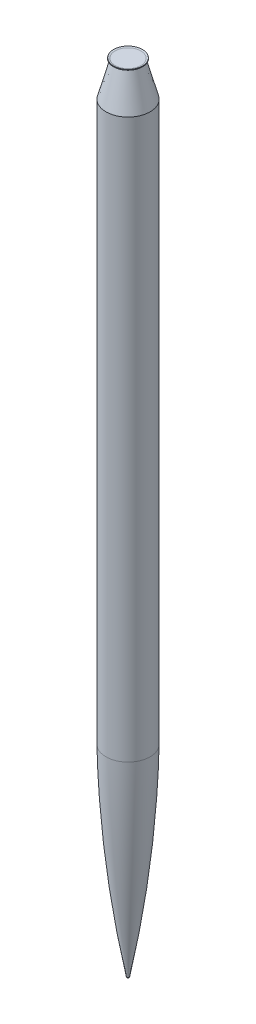
ISO-10303-21;
HEADER;
FILE_DESCRIPTION(('STEP AP214'),'2;1');
FILE_NAME('part.step','',(''),(''),'','','');
FILE_SCHEMA(('AUTOMOTIVE_DESIGN { 1 0 10303 214 1 1 1 1 }'));
ENDSEC;
DATA;
#1=APPLICATION_CONTEXT('core data for automotive mechanical design processes');
#2=APPLICATION_PROTOCOL_DEFINITION('international standard','automotive_design',2000,#1);
#3=PRODUCT_CONTEXT('',#1,'mechanical');
#4=PRODUCT('Part','Part','',(#3));
#5=PRODUCT_RELATED_PRODUCT_CATEGORY('part','',(#4));
#6=PRODUCT_DEFINITION_FORMATION('','',#4);
#7=PRODUCT_DEFINITION_CONTEXT('part definition',#1,'design');
#8=PRODUCT_DEFINITION('design','',#6,#7);
#9=PRODUCT_DEFINITION_SHAPE('','',#8);
#10=(LENGTH_UNIT() NAMED_UNIT(*) SI_UNIT(.MILLI.,.METRE.));
#11=(NAMED_UNIT(*) PLANE_ANGLE_UNIT() SI_UNIT($,.RADIAN.));
#12=(NAMED_UNIT(*) SI_UNIT($,.STERADIAN.) SOLID_ANGLE_UNIT());
#13=UNCERTAINTY_MEASURE_WITH_UNIT(LENGTH_MEASURE(1.E-05),#10,'distance_accuracy_value','');
#14=(GEOMETRIC_REPRESENTATION_CONTEXT(3) GLOBAL_UNCERTAINTY_ASSIGNED_CONTEXT((#13)) GLOBAL_UNIT_ASSIGNED_CONTEXT((#10,
#11,#12)) REPRESENTATION_CONTEXT('',''));
#15=CARTESIAN_POINT('',(0.,0.,0.));
#16=DIRECTION('',(0.,0.,1.));
#17=DIRECTION('',(1.,0.,0.));
#18=AXIS2_PLACEMENT_3D('',#15,#16,#17);
#19=CARTESIAN_POINT('',(0.,298.198587557185,0.));
#20=DIRECTION('',(0.,-1.,0.));
#21=DIRECTION('',(0.,0.,-1.));
#22=AXIS2_PLACEMENT_3D('',#19,#20,#21);
#23=DEGENERATE_TOROIDAL_SURFACE('',#22,1526.98630276103,1555.83082834892,.F.);
#24=CARTESIAN_POINT('',(0.,8.03485856842852,0.));
#25=DIRECTION('',(0.,-1.,0.));
#26=DIRECTION('',(0.,0.,-1.));
#27=AXIS2_PLACEMENT_3D('',#24,#25,#26);
#28=CIRCLE('',#27,1.5471698264169);
#29=CARTESIAN_POINT('',(0.,8.03485856842852,-1.5471698264169));
#30=VERTEX_POINT('',#29);
#31=EDGE_CURVE('E50',#30,#30,#28,.T.);
#32=ORIENTED_EDGE('',*,*,#31,.F.);
#33=EDGE_LOOP('',(#32));
#34=FACE_BOUND('',#33,.T.);
#35=CARTESIAN_POINT('',(0.,269.24,0.));
#36=DIRECTION('',(0.,-1.,0.));
#37=DIRECTION('',(0.,0.,-1.));
#38=AXIS2_PLACEMENT_3D('',#35,#36,#37);
#39=CIRCLE('',#38,28.575);
#40=CARTESIAN_POINT('',(0.,269.24,-28.575));
#41=VERTEX_POINT('',#40);
#42=EDGE_CURVE('E10',#41,#41,#39,.T.);
#43=ORIENTED_EDGE('',*,*,#42,.T.);
#44=EDGE_LOOP('',(#43));
#45=FACE_BOUND('',#44,.T.);
#46=ADVANCED_FACE('F43',(#34,#45),#23,.F.);
#47=CARTESIAN_POINT('',(0.,0.,0.));
#48=DIRECTION('',(0.,-1.,0.));
#49=DIRECTION('',(0.,0.,-1.));
#50=AXIS2_PLACEMENT_3D('',#47,#48,#49);
#51=CYLINDRICAL_SURFACE('',#50,28.575);
#52=ORIENTED_EDGE('',*,*,#42,.F.);
#53=EDGE_LOOP('',(#52));
#54=FACE_BOUND('',#53,.T.);
#55=CARTESIAN_POINT('',(0.,994.156,0.));
#56=DIRECTION('',(0.,1.,0.));
#57=DIRECTION('',(-1.,0.,0.));
#58=AXIS2_PLACEMENT_3D('',#55,#56,#57);
#59=CIRCLE('',#58,28.575);
#60=CARTESIAN_POINT('',(-28.575,994.156,0.));
#61=VERTEX_POINT('',#60);
#62=EDGE_CURVE('E60',#61,#61,#59,.T.);
#63=ORIENTED_EDGE('',*,*,#62,.F.);
#64=EDGE_LOOP('',(#63));
#65=FACE_BOUND('',#64,.T.);
#66=ADVANCED_FACE('F100',(#54,#65),#51,.T.);
#67=CARTESIAN_POINT('',(0.,8.32856006353028,0.));
#68=DIRECTION('',(0.,-1.,0.));
#69=DIRECTION('',(-1.,0.,0.));
#70=AXIS2_PLACEMENT_3D('',#67,#68,#69);
#71=SPHERICAL_SURFACE('',#70,1.57479999999997);
#72=ORIENTED_EDGE('',*,*,#31,.T.);
#73=EDGE_LOOP('',(#72));
#74=FACE_BOUND('',#73,.T.);
#75=ADVANCED_FACE('F95',(#74),#71,.T.);
#76=CARTESIAN_POINT('',(0.,994.156,0.));
#77=DIRECTION('',(0.,-1.,0.));
#78=DIRECTION('',(1.,0.,0.));
#79=AXIS2_PLACEMENT_3D('',#76,#77,#78);
#80=CONICAL_SURFACE('',#79,28.575,0.261799387799151);
#81=CARTESIAN_POINT('',(0.,1038.54457048154,0.));
#82=DIRECTION('',(0.,1.,0.));
#83=DIRECTION('',(-1.,0.,0.));
#84=AXIS2_PLACEMENT_3D('',#81,#82,#83);
#85=CIRCLE('',#84,16.6811183862991);
#86=CARTESIAN_POINT('',(-16.6811183862991,1038.54457048154,0.));
#87=VERTEX_POINT('',#86);
#88=EDGE_CURVE('E55',#87,#87,#85,.T.);
#89=ORIENTED_EDGE('',*,*,#88,.F.);
#90=EDGE_LOOP('',(#89));
#91=FACE_BOUND('',#90,.T.);
#92=ORIENTED_EDGE('',*,*,#62,.T.);
#93=EDGE_LOOP('',(#92));
#94=FACE_BOUND('',#93,.T.);
#95=ADVANCED_FACE('F88',(#91,#94),#80,.T.);
#96=CARTESIAN_POINT('',(0.,1038.74179059391,0.));
#97=DIRECTION('',(0.,1.,0.));
#98=DIRECTION('',(-1.,0.,0.));
#99=AXIS2_PLACEMENT_3D('',#96,#97,#98);
#100=TOROIDAL_SURFACE('',#99,17.4171538659313,0.762000000000035);
#101=CARTESIAN_POINT('',(0.,1039.47782607354,0.));
#102=DIRECTION('',(0.,1.,0.));
#103=DIRECTION('',(-1.,0.,0.));
#104=AXIS2_PLACEMENT_3D('',#101,#102,#103);
#105=CIRCLE('',#104,17.2199337535632);
#106=CARTESIAN_POINT('',(-17.2199337535631,1039.47782607354,0.));
#107=VERTEX_POINT('',#106);
#108=EDGE_CURVE('E78',#107,#107,#105,.T.);
#109=ORIENTED_EDGE('',*,*,#108,.F.);
#110=EDGE_LOOP('',(#109));
#111=FACE_BOUND('',#110,.T.);
#112=ORIENTED_EDGE('',*,*,#88,.T.);
#113=EDGE_LOOP('',(#112));
#114=FACE_BOUND('',#113,.T.);
#115=ADVANCED_FACE('F85',(#111,#114),#100,.F.);
#116=CARTESIAN_POINT('',(0.,1039.47782607354,0.));
#117=DIRECTION('',(0.,1.,0.));
#118=DIRECTION('',(-1.,0.,0.));
#119=AXIS2_PLACEMENT_3D('',#116,#117,#118);
#120=CONICAL_SURFACE('',#119,17.2199337535632,1.30899693899579);
#121=CARTESIAN_POINT('',(0.,1039.92070867289,0.));
#122=DIRECTION('',(0.,1.,0.));
#123=DIRECTION('',(-1.,0.,0.));
#124=AXIS2_PLACEMENT_3D('',#121,#122,#123);
#125=CIRCLE('',#124,18.8727941161137);
#126=CARTESIAN_POINT('',(-18.8727941161137,1039.92070867289,0.));
#127=VERTEX_POINT('',#126);
#128=EDGE_CURVE('E74',#127,#127,#125,.T.);
#129=ORIENTED_EDGE('',*,*,#128,.F.);
#130=EDGE_LOOP('',(#129));
#131=FACE_BOUND('',#130,.T.);
#132=ORIENTED_EDGE('',*,*,#108,.T.);
#133=EDGE_LOOP('',(#132));
#134=FACE_BOUND('',#133,.T.);
#135=ADVANCED_FACE('F83',(#131,#134),#120,.T.);
#136=CARTESIAN_POINT('',(0.,1039.92070867289,0.));
#137=DIRECTION('',(0.,-1.,0.));
#138=DIRECTION('',(1.,0.,0.));
#139=AXIS2_PLACEMENT_3D('',#136,#137,#138);
#140=CONICAL_SURFACE('',#139,18.8727941161137,0.261799387799159);
#141=CARTESIAN_POINT('',(0.,1040.68127866851,0.));
#142=DIRECTION('',(0.,1.,0.));
#143=DIRECTION('',(-1.,0.,0.));
#144=AXIS2_PLACEMENT_3D('',#141,#142,#143);
#145=CIRCLE('',#144,18.669);
#146=CARTESIAN_POINT('',(-18.6689999999999,1040.68127866851,0.));
#147=VERTEX_POINT('',#146);
#148=EDGE_CURVE('E70',#147,#147,#145,.T.);
#149=ORIENTED_EDGE('',*,*,#148,.F.);
#150=EDGE_LOOP('',(#149));
#151=FACE_BOUND('',#150,.T.);
#152=ORIENTED_EDGE('',*,*,#128,.T.);
#153=EDGE_LOOP('',(#152));
#154=FACE_BOUND('',#153,.T.);
#155=ADVANCED_FACE('F90',(#151,#154),#140,.T.);
#156=CARTESIAN_POINT('',(0.,1040.68127866851,0.));
#157=DIRECTION('',(0.,1.,0.));
#158=DIRECTION('',(-1.,0.,0.));
#159=AXIS2_PLACEMENT_3D('',#156,#157,#158);
#160=CONICAL_SURFACE('',#159,18.669,1.30899693899564);
#161=CARTESIAN_POINT('',(0.,1040.13,0.));
#162=DIRECTION('',(0.,1.,0.));
#163=DIRECTION('',(-1.,0.,0.));
#164=AXIS2_PLACEMENT_3D('',#161,#162,#163);
#165=CIRCLE('',#164,16.6116);
#166=CARTESIAN_POINT('',(-16.6116,1040.13,0.));
#167=VERTEX_POINT('',#166);
#168=EDGE_CURVE('E66',#167,#167,#165,.T.);
#169=ORIENTED_EDGE('',*,*,#168,.F.);
#170=EDGE_LOOP('',(#169));
#171=FACE_BOUND('',#170,.T.);
#172=ORIENTED_EDGE('',*,*,#148,.T.);
#173=EDGE_LOOP('',(#172));
#174=FACE_BOUND('',#173,.T.);
#175=ADVANCED_FACE('F112',(#171,#174),#160,.F.);
#176=CARTESIAN_POINT('',(0.,1040.13,0.));
#177=DIRECTION('',(0.,-1.,0.));
#178=DIRECTION('',(1.,0.,0.));
#179=AXIS2_PLACEMENT_3D('',#176,#177,#178);
#180=PLANE('',#179);
#181=ORIENTED_EDGE('',*,*,#168,.T.);
#182=EDGE_LOOP('',(#181));
#183=FACE_BOUND('',#182,.T.);
#184=ADVANCED_FACE('F97',(#183),#180,.F.);
#185=CLOSED_SHELL('',(#46,#66,#75,#95,#115,#135,#155,#175,#184));
#186=MANIFOLD_SOLID_BREP('B2',#185);
#187=ADVANCED_BREP_SHAPE_REPRESENTATION('',(#18,#186),#14);
#188=SHAPE_DEFINITION_REPRESENTATION(#9,#187);
ENDSEC;
END-ISO-10303-21;
